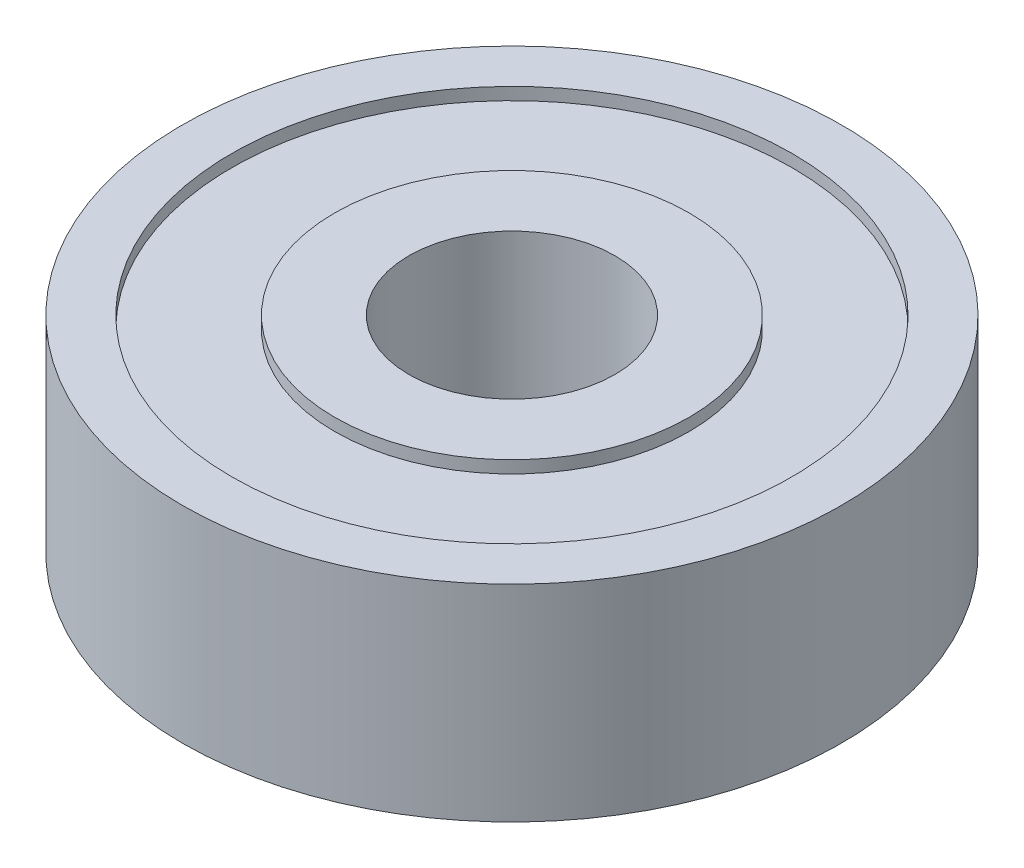
ISO-10303-21;
HEADER;
FILE_DESCRIPTION(('STEP AP214'),'2;1');
FILE_NAME('part.step','',(''),(''),'','','');
FILE_SCHEMA(('AUTOMOTIVE_DESIGN { 1 0 10303 214 1 1 1 1 }'));
ENDSEC;
DATA;
#1=APPLICATION_CONTEXT('core data for automotive mechanical design processes');
#2=APPLICATION_PROTOCOL_DEFINITION('international standard','automotive_design',2000,#1);
#3=PRODUCT_CONTEXT('',#1,'mechanical');
#4=PRODUCT('Part','Part','',(#3));
#5=PRODUCT_RELATED_PRODUCT_CATEGORY('part','',(#4));
#6=PRODUCT_DEFINITION_FORMATION('','',#4);
#7=PRODUCT_DEFINITION_CONTEXT('part definition',#1,'design');
#8=PRODUCT_DEFINITION('design','',#6,#7);
#9=PRODUCT_DEFINITION_SHAPE('','',#8);
#10=(LENGTH_UNIT() NAMED_UNIT(*) SI_UNIT(.MILLI.,.METRE.));
#11=(NAMED_UNIT(*) PLANE_ANGLE_UNIT() SI_UNIT($,.RADIAN.));
#12=(NAMED_UNIT(*) SI_UNIT($,.STERADIAN.) SOLID_ANGLE_UNIT());
#13=UNCERTAINTY_MEASURE_WITH_UNIT(LENGTH_MEASURE(1.E-05),#10,'distance_accuracy_value','');
#14=(GEOMETRIC_REPRESENTATION_CONTEXT(3) GLOBAL_UNCERTAINTY_ASSIGNED_CONTEXT((#13)) GLOBAL_UNIT_ASSIGNED_CONTEXT((#10,
#11,#12)) REPRESENTATION_CONTEXT('',''));
#15=CARTESIAN_POINT('',(0.,0.,0.));
#16=DIRECTION('',(0.,0.,1.));
#17=DIRECTION('',(1.,0.,0.));
#18=AXIS2_PLACEMENT_3D('',#15,#16,#17);
#19=CARTESIAN_POINT('',(0.,4.82499999999999,0.));
#20=DIRECTION('',(0.,1.,0.));
#21=DIRECTION('',(0.,0.,1.));
#22=AXIS2_PLACEMENT_3D('',#19,#20,#21);
#23=CYLINDRICAL_SURFACE('',#22,4.3);
#24=CARTESIAN_POINT('',(0.,2.5,0.));
#25=DIRECTION('',(0.,1.,0.));
#26=DIRECTION('',(0.,0.,1.));
#27=AXIS2_PLACEMENT_3D('',#24,#25,#26);
#28=CIRCLE('',#27,4.3);
#29=CARTESIAN_POINT('',(0.,2.5,4.3));
#30=VERTEX_POINT('',#29);
#31=EDGE_CURVE('E10',#30,#30,#28,.T.);
#32=ORIENTED_EDGE('',*,*,#31,.F.);
#33=EDGE_LOOP('',(#32));
#34=FACE_BOUND('',#33,.T.);
#35=CARTESIAN_POINT('',(0.,2.2,0.));
#36=DIRECTION('',(0.,1.,0.));
#37=DIRECTION('',(0.,0.,1.));
#38=AXIS2_PLACEMENT_3D('',#35,#36,#37);
#39=CIRCLE('',#38,4.3);
#40=CARTESIAN_POINT('',(0.,2.2,4.3));
#41=VERTEX_POINT('',#40);
#42=EDGE_CURVE('E75',#41,#41,#39,.T.);
#43=ORIENTED_EDGE('',*,*,#42,.T.);
#44=EDGE_LOOP('',(#43));
#45=FACE_BOUND('',#44,.T.);
#46=ADVANCED_FACE('F35',(#34,#45),#23,.T.);
#47=CARTESIAN_POINT('',(0.,2.5,-2.5));
#48=DIRECTION('',(0.,-1.,0.));
#49=DIRECTION('',(0.,0.,-1.));
#50=AXIS2_PLACEMENT_3D('',#47,#48,#49);
#51=PLANE('',#50);
#52=CARTESIAN_POINT('',(0.,2.5,0.));
#53=DIRECTION('',(0.,1.,0.));
#54=DIRECTION('',(0.,0.,1.));
#55=AXIS2_PLACEMENT_3D('',#52,#53,#54);
#56=CIRCLE('',#55,2.5);
#57=CARTESIAN_POINT('',(0.,2.5,2.5));
#58=VERTEX_POINT('',#57);
#59=EDGE_CURVE('E41',#58,#58,#56,.T.);
#60=ORIENTED_EDGE('',*,*,#59,.F.);
#61=EDGE_LOOP('',(#60));
#62=FACE_BOUND('',#61,.T.);
#63=ORIENTED_EDGE('',*,*,#31,.T.);
#64=EDGE_LOOP('',(#63));
#65=FACE_BOUND('',#64,.T.);
#66=ADVANCED_FACE('F136',(#62,#65),#51,.F.);
#67=CARTESIAN_POINT('',(0.,4.82499999999999,0.));
#68=DIRECTION('',(0.,1.,0.));
#69=DIRECTION('',(0.,0.,1.));
#70=AXIS2_PLACEMENT_3D('',#67,#68,#69);
#71=CYLINDRICAL_SURFACE('',#70,2.5);
#72=CARTESIAN_POINT('',(0.,-2.5,0.));
#73=DIRECTION('',(0.,1.,0.));
#74=DIRECTION('',(0.,0.,1.));
#75=AXIS2_PLACEMENT_3D('',#72,#73,#74);
#76=CIRCLE('',#75,2.5);
#77=CARTESIAN_POINT('',(0.,-2.5,2.5));
#78=VERTEX_POINT('',#77);
#79=EDGE_CURVE('E45',#78,#78,#76,.T.);
#80=ORIENTED_EDGE('',*,*,#79,.F.);
#81=EDGE_LOOP('',(#80));
#82=FACE_BOUND('',#81,.T.);
#83=ORIENTED_EDGE('',*,*,#59,.T.);
#84=EDGE_LOOP('',(#83));
#85=FACE_BOUND('',#84,.T.);
#86=ADVANCED_FACE('F131',(#82,#85),#71,.F.);
#87=CARTESIAN_POINT('',(0.,-2.5,-2.5));
#88=DIRECTION('',(0.,1.,0.));
#89=DIRECTION('',(0.,0.,1.));
#90=AXIS2_PLACEMENT_3D('',#87,#88,#89);
#91=PLANE('',#90);
#92=CARTESIAN_POINT('',(0.,-2.5,0.));
#93=DIRECTION('',(0.,1.,0.));
#94=DIRECTION('',(0.,0.,1.));
#95=AXIS2_PLACEMENT_3D('',#92,#93,#94);
#96=CIRCLE('',#95,4.3);
#97=CARTESIAN_POINT('',(0.,-2.5,4.3));
#98=VERTEX_POINT('',#97);
#99=EDGE_CURVE('E49',#98,#98,#96,.T.);
#100=ORIENTED_EDGE('',*,*,#99,.F.);
#101=EDGE_LOOP('',(#100));
#102=FACE_BOUND('',#101,.T.);
#103=ORIENTED_EDGE('',*,*,#79,.T.);
#104=EDGE_LOOP('',(#103));
#105=FACE_BOUND('',#104,.T.);
#106=ADVANCED_FACE('F125',(#102,#105),#91,.F.);
#107=CARTESIAN_POINT('',(0.,4.82499999999999,0.));
#108=DIRECTION('',(0.,1.,0.));
#109=DIRECTION('',(0.,0.,1.));
#110=AXIS2_PLACEMENT_3D('',#107,#108,#109);
#111=CYLINDRICAL_SURFACE('',#110,4.3);
#112=CARTESIAN_POINT('',(0.,-2.2,0.));
#113=DIRECTION('',(0.,1.,0.));
#114=DIRECTION('',(0.,0.,1.));
#115=AXIS2_PLACEMENT_3D('',#112,#113,#114);
#116=CIRCLE('',#115,4.3);
#117=CARTESIAN_POINT('',(0.,-2.2,4.3));
#118=VERTEX_POINT('',#117);
#119=EDGE_CURVE('E54',#118,#118,#116,.T.);
#120=ORIENTED_EDGE('',*,*,#119,.F.);
#121=EDGE_LOOP('',(#120));
#122=FACE_BOUND('',#121,.T.);
#123=ORIENTED_EDGE('',*,*,#99,.T.);
#124=EDGE_LOOP('',(#123));
#125=FACE_BOUND('',#124,.T.);
#126=ADVANCED_FACE('F119',(#122,#125),#111,.T.);
#127=CARTESIAN_POINT('',(0.,-2.2,-4.3));
#128=DIRECTION('',(0.,1.,0.));
#129=DIRECTION('',(0.,0.,1.));
#130=AXIS2_PLACEMENT_3D('',#127,#128,#129);
#131=PLANE('',#130);
#132=CARTESIAN_POINT('',(0.,-2.2,0.));
#133=DIRECTION('',(0.,1.,0.));
#134=DIRECTION('',(0.,0.,1.));
#135=AXIS2_PLACEMENT_3D('',#132,#133,#134);
#136=CIRCLE('',#135,6.8);
#137=CARTESIAN_POINT('',(0.,-2.2,6.8));
#138=VERTEX_POINT('',#137);
#139=EDGE_CURVE('E57',#138,#138,#136,.T.);
#140=ORIENTED_EDGE('',*,*,#139,.F.);
#141=EDGE_LOOP('',(#140));
#142=FACE_BOUND('',#141,.T.);
#143=ORIENTED_EDGE('',*,*,#119,.T.);
#144=EDGE_LOOP('',(#143));
#145=FACE_BOUND('',#144,.T.);
#146=ADVANCED_FACE('F113',(#142,#145),#131,.F.);
#147=CARTESIAN_POINT('',(0.,4.82499999999999,0.));
#148=DIRECTION('',(0.,1.,0.));
#149=DIRECTION('',(0.,0.,1.));
#150=AXIS2_PLACEMENT_3D('',#147,#148,#149);
#151=CYLINDRICAL_SURFACE('',#150,6.8);
#152=CARTESIAN_POINT('',(0.,-2.5,0.));
#153=DIRECTION('',(0.,1.,0.));
#154=DIRECTION('',(0.,0.,1.));
#155=AXIS2_PLACEMENT_3D('',#152,#153,#154);
#156=CIRCLE('',#155,6.8);
#157=CARTESIAN_POINT('',(0.,-2.5,6.8));
#158=VERTEX_POINT('',#157);
#159=EDGE_CURVE('E60',#158,#158,#156,.T.);
#160=ORIENTED_EDGE('',*,*,#159,.F.);
#161=EDGE_LOOP('',(#160));
#162=FACE_BOUND('',#161,.T.);
#163=ORIENTED_EDGE('',*,*,#139,.T.);
#164=EDGE_LOOP('',(#163));
#165=FACE_BOUND('',#164,.T.);
#166=ADVANCED_FACE('F107',(#162,#165),#151,.F.);
#167=CARTESIAN_POINT('',(0.,-2.5,-6.8));
#168=DIRECTION('',(0.,1.,0.));
#169=DIRECTION('',(0.,0.,1.));
#170=AXIS2_PLACEMENT_3D('',#167,#168,#169);
#171=PLANE('',#170);
#172=CARTESIAN_POINT('',(0.,-2.5,0.));
#173=DIRECTION('',(0.,1.,0.));
#174=DIRECTION('',(0.,0.,1.));
#175=AXIS2_PLACEMENT_3D('',#172,#173,#174);
#176=CIRCLE('',#175,8.);
#177=CARTESIAN_POINT('',(0.,-2.5,8.));
#178=VERTEX_POINT('',#177);
#179=EDGE_CURVE('E63',#178,#178,#176,.T.);
#180=ORIENTED_EDGE('',*,*,#179,.F.);
#181=EDGE_LOOP('',(#180));
#182=FACE_BOUND('',#181,.T.);
#183=ORIENTED_EDGE('',*,*,#159,.T.);
#184=EDGE_LOOP('',(#183));
#185=FACE_BOUND('',#184,.T.);
#186=ADVANCED_FACE('F101',(#182,#185),#171,.F.);
#187=CARTESIAN_POINT('',(0.,4.82499999999999,0.));
#188=DIRECTION('',(0.,1.,0.));
#189=DIRECTION('',(0.,0.,1.));
#190=AXIS2_PLACEMENT_3D('',#187,#188,#189);
#191=CYLINDRICAL_SURFACE('',#190,8.);
#192=CARTESIAN_POINT('',(0.,2.5,0.));
#193=DIRECTION('',(0.,1.,0.));
#194=DIRECTION('',(0.,0.,1.));
#195=AXIS2_PLACEMENT_3D('',#192,#193,#194);
#196=CIRCLE('',#195,8.);
#197=CARTESIAN_POINT('',(0.,2.5,8.));
#198=VERTEX_POINT('',#197);
#199=EDGE_CURVE('E66',#198,#198,#196,.T.);
#200=ORIENTED_EDGE('',*,*,#199,.F.);
#201=EDGE_LOOP('',(#200));
#202=FACE_BOUND('',#201,.T.);
#203=ORIENTED_EDGE('',*,*,#179,.T.);
#204=EDGE_LOOP('',(#203));
#205=FACE_BOUND('',#204,.T.);
#206=ADVANCED_FACE('F95',(#202,#205),#191,.T.);
#207=CARTESIAN_POINT('',(0.,2.5,-6.8));
#208=DIRECTION('',(0.,-1.,0.));
#209=DIRECTION('',(0.,0.,-1.));
#210=AXIS2_PLACEMENT_3D('',#207,#208,#209);
#211=PLANE('',#210);
#212=CARTESIAN_POINT('',(0.,2.5,0.));
#213=DIRECTION('',(0.,1.,0.));
#214=DIRECTION('',(0.,0.,1.));
#215=AXIS2_PLACEMENT_3D('',#212,#213,#214);
#216=CIRCLE('',#215,6.8);
#217=CARTESIAN_POINT('',(0.,2.5,6.8));
#218=VERTEX_POINT('',#217);
#219=EDGE_CURVE('E69',#218,#218,#216,.T.);
#220=ORIENTED_EDGE('',*,*,#219,.F.);
#221=EDGE_LOOP('',(#220));
#222=FACE_BOUND('',#221,.T.);
#223=ORIENTED_EDGE('',*,*,#199,.T.);
#224=EDGE_LOOP('',(#223));
#225=FACE_BOUND('',#224,.T.);
#226=ADVANCED_FACE('F89',(#222,#225),#211,.F.);
#227=CARTESIAN_POINT('',(0.,4.82499999999999,0.));
#228=DIRECTION('',(0.,1.,0.));
#229=DIRECTION('',(0.,0.,1.));
#230=AXIS2_PLACEMENT_3D('',#227,#228,#229);
#231=CYLINDRICAL_SURFACE('',#230,6.8);
#232=CARTESIAN_POINT('',(0.,2.2,0.));
#233=DIRECTION('',(0.,1.,0.));
#234=DIRECTION('',(0.,0.,1.));
#235=AXIS2_PLACEMENT_3D('',#232,#233,#234);
#236=CIRCLE('',#235,6.8);
#237=CARTESIAN_POINT('',(0.,2.2,6.8));
#238=VERTEX_POINT('',#237);
#239=EDGE_CURVE('E72',#238,#238,#236,.T.);
#240=ORIENTED_EDGE('',*,*,#239,.F.);
#241=EDGE_LOOP('',(#240));
#242=FACE_BOUND('',#241,.T.);
#243=ORIENTED_EDGE('',*,*,#219,.T.);
#244=EDGE_LOOP('',(#243));
#245=FACE_BOUND('',#244,.T.);
#246=ADVANCED_FACE('F83',(#242,#245),#231,.F.);
#247=CARTESIAN_POINT('',(0.,2.2,-4.3));
#248=DIRECTION('',(0.,-1.,0.));
#249=DIRECTION('',(0.,0.,-1.));
#250=AXIS2_PLACEMENT_3D('',#247,#248,#249);
#251=PLANE('',#250);
#252=ORIENTED_EDGE('',*,*,#42,.F.);
#253=EDGE_LOOP('',(#252));
#254=FACE_BOUND('',#253,.T.);
#255=ORIENTED_EDGE('',*,*,#239,.T.);
#256=EDGE_LOOP('',(#255));
#257=FACE_BOUND('',#256,.T.);
#258=ADVANCED_FACE('F80',(#254,#257),#251,.F.);
#259=CLOSED_SHELL('',(#46,#66,#86,#106,#126,#146,#166,#186,#206,#226,#246,#258));
#260=MANIFOLD_SOLID_BREP('B2',#259);
#261=ADVANCED_BREP_SHAPE_REPRESENTATION('',(#18,#260),#14);
#262=SHAPE_DEFINITION_REPRESENTATION(#9,#261);
ENDSEC;
END-ISO-10303-21;
